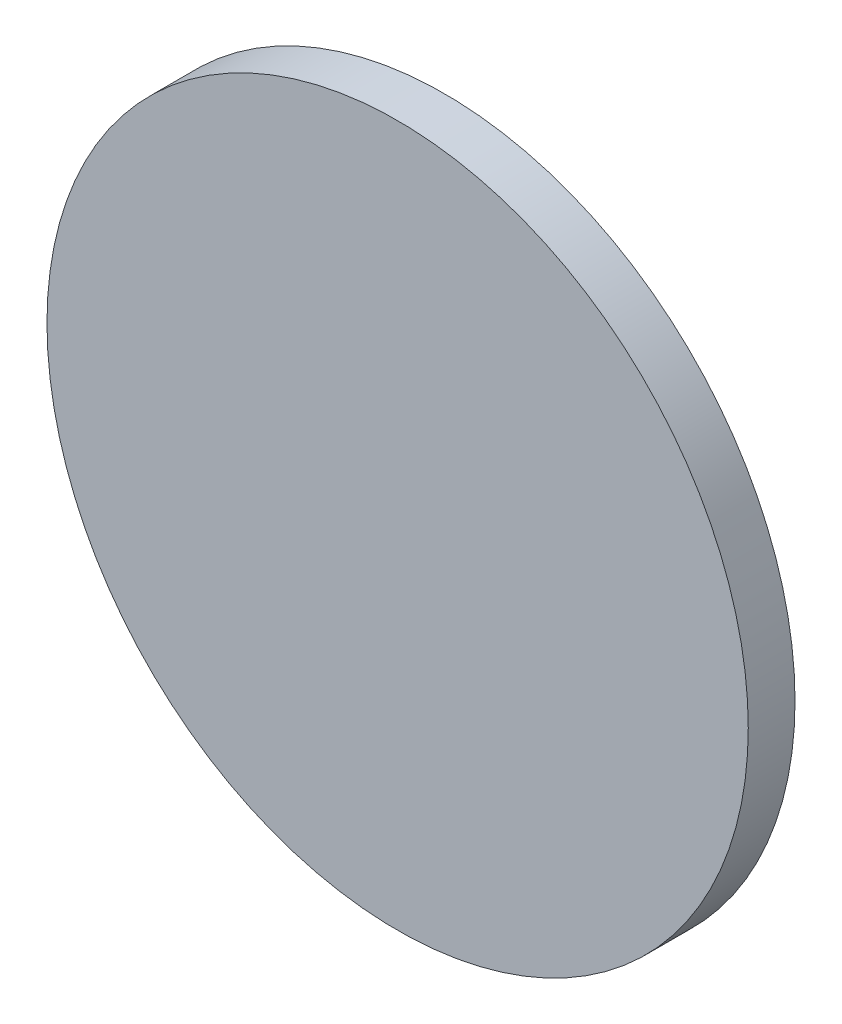
ISO-10303-21;
HEADER;
FILE_DESCRIPTION(('STEP AP214'),'2;1');
FILE_NAME('part.step','',(''),(''),'','','');
FILE_SCHEMA(('AUTOMOTIVE_DESIGN { 1 0 10303 214 1 1 1 1 }'));
ENDSEC;
DATA;
#1=APPLICATION_CONTEXT('core data for automotive mechanical design processes');
#2=APPLICATION_PROTOCOL_DEFINITION('international standard','automotive_design',2000,#1);
#3=PRODUCT_CONTEXT('',#1,'mechanical');
#4=PRODUCT('Part','Part','',(#3));
#5=PRODUCT_RELATED_PRODUCT_CATEGORY('part','',(#4));
#6=PRODUCT_DEFINITION_FORMATION('','',#4);
#7=PRODUCT_DEFINITION_CONTEXT('part definition',#1,'design');
#8=PRODUCT_DEFINITION('design','',#6,#7);
#9=PRODUCT_DEFINITION_SHAPE('','',#8);
#10=(LENGTH_UNIT() NAMED_UNIT(*) SI_UNIT(.MILLI.,.METRE.));
#11=(NAMED_UNIT(*) PLANE_ANGLE_UNIT() SI_UNIT($,.RADIAN.));
#12=(NAMED_UNIT(*) SI_UNIT($,.STERADIAN.) SOLID_ANGLE_UNIT());
#13=UNCERTAINTY_MEASURE_WITH_UNIT(LENGTH_MEASURE(1.E-05),#10,'distance_accuracy_value','');
#14=(GEOMETRIC_REPRESENTATION_CONTEXT(3) GLOBAL_UNCERTAINTY_ASSIGNED_CONTEXT((#13)) GLOBAL_UNIT_ASSIGNED_CONTEXT((#10,
#11,#12)) REPRESENTATION_CONTEXT('',''));
#15=CARTESIAN_POINT('',(0.,0.,0.));
#16=DIRECTION('',(0.,0.,1.));
#17=DIRECTION('',(1.,0.,0.));
#18=AXIS2_PLACEMENT_3D('',#15,#16,#17);
#19=CARTESIAN_POINT('',(0.,0.,34.));
#20=DIRECTION('',(0.,0.,1.));
#21=DIRECTION('',(1.,0.,0.));
#22=AXIS2_PLACEMENT_3D('',#19,#20,#21);
#23=PLANE('',#22);
#24=CARTESIAN_POINT('',(0.,0.,34.));
#25=DIRECTION('',(0.,0.,1.));
#26=DIRECTION('',(1.,0.,0.));
#27=AXIS2_PLACEMENT_3D('',#24,#25,#26);
#28=CIRCLE('',#27,45.);
#29=CARTESIAN_POINT('',(45.,0.,34.));
#30=VERTEX_POINT('',#29);
#31=EDGE_CURVE('E10',#30,#30,#28,.T.);
#32=ORIENTED_EDGE('',*,*,#31,.F.);
#33=EDGE_LOOP('',(#32));
#34=FACE_BOUND('',#33,.T.);
#35=ADVANCED_FACE('F16',(#34),#23,.F.);
#36=CARTESIAN_POINT('',(0.,0.,40.));
#37=DIRECTION('',(0.,0.,1.));
#38=DIRECTION('',(1.,0.,0.));
#39=AXIS2_PLACEMENT_3D('',#36,#37,#38);
#40=PLANE('',#39);
#41=CARTESIAN_POINT('',(0.,0.,40.));
#42=DIRECTION('',(0.,0.,1.));
#43=DIRECTION('',(1.,0.,0.));
#44=AXIS2_PLACEMENT_3D('',#41,#42,#43);
#45=CIRCLE('',#44,45.);
#46=CARTESIAN_POINT('',(45.,0.,40.));
#47=VERTEX_POINT('',#46);
#48=EDGE_CURVE('E40',#47,#47,#45,.T.);
#49=ORIENTED_EDGE('',*,*,#48,.T.);
#50=EDGE_LOOP('',(#49));
#51=FACE_BOUND('',#50,.T.);
#52=ADVANCED_FACE('F43',(#51),#40,.T.);
#53=CARTESIAN_POINT('',(0.,0.,34.));
#54=DIRECTION('',(0.,0.,1.));
#55=DIRECTION('',(1.,0.,0.));
#56=AXIS2_PLACEMENT_3D('',#53,#54,#55);
#57=CYLINDRICAL_SURFACE('',#56,45.);
#58=ORIENTED_EDGE('',*,*,#48,.F.);
#59=DIRECTION('',(0.,0.,1.));
#60=VECTOR('',#59,1.);
#61=CARTESIAN_POINT('',(45.,0.,34.));
#62=LINE('',#61,#60);
#63=EDGE_CURVE('E19',#30,#47,#62,.T.);
#64=ORIENTED_EDGE('',*,*,#63,.F.);
#65=ORIENTED_EDGE('',*,*,#31,.T.);
#66=ORIENTED_EDGE('',*,*,#63,.T.);
#67=EDGE_LOOP('',(#58,#64,#65,#66));
#68=FACE_BOUND('',#67,.T.);
#69=ADVANCED_FACE('F39',(#68),#57,.T.);
#70=CLOSED_SHELL('',(#35,#52,#69));
#71=MANIFOLD_SOLID_BREP('B1',#70);
#72=ADVANCED_BREP_SHAPE_REPRESENTATION('',(#18,#71),#14);
#73=SHAPE_DEFINITION_REPRESENTATION(#9,#72);
ENDSEC;
END-ISO-10303-21;
